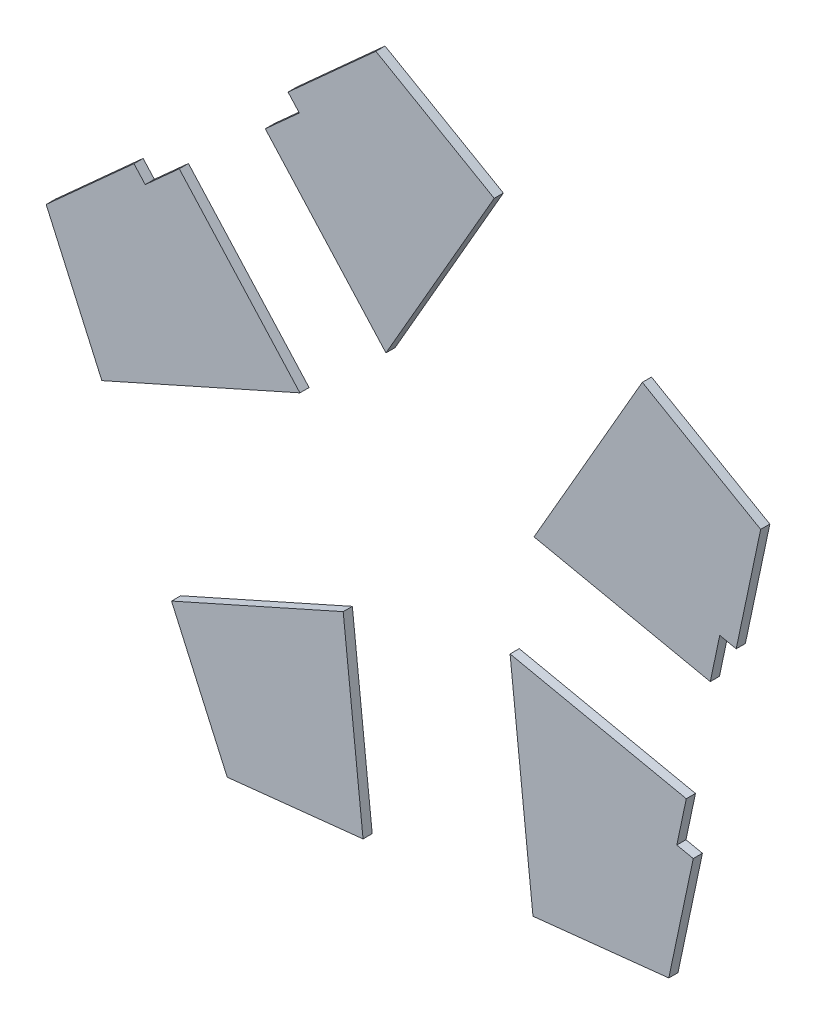
ISO-10303-21;
HEADER;
FILE_DESCRIPTION(('STEP AP214'),'2;1');
FILE_NAME('part.step','',(''),(''),'','','');
FILE_SCHEMA(('AUTOMOTIVE_DESIGN { 1 0 10303 214 1 1 1 1 }'));
ENDSEC;
DATA;
#1=APPLICATION_CONTEXT('core data for automotive mechanical design processes');
#2=APPLICATION_PROTOCOL_DEFINITION('international standard','automotive_design',2000,#1);
#3=PRODUCT_CONTEXT('',#1,'mechanical');
#4=PRODUCT('Part','Part','',(#3));
#5=PRODUCT_RELATED_PRODUCT_CATEGORY('part','',(#4));
#6=PRODUCT_DEFINITION_FORMATION('','',#4);
#7=PRODUCT_DEFINITION_CONTEXT('part definition',#1,'design');
#8=PRODUCT_DEFINITION('design','',#6,#7);
#9=PRODUCT_DEFINITION_SHAPE('','',#8);
#10=(LENGTH_UNIT() NAMED_UNIT(*) SI_UNIT(.MILLI.,.METRE.));
#11=(NAMED_UNIT(*) PLANE_ANGLE_UNIT() SI_UNIT($,.RADIAN.));
#12=(NAMED_UNIT(*) SI_UNIT($,.STERADIAN.) SOLID_ANGLE_UNIT());
#13=UNCERTAINTY_MEASURE_WITH_UNIT(LENGTH_MEASURE(1.E-05),#10,'distance_accuracy_value','');
#14=(GEOMETRIC_REPRESENTATION_CONTEXT(3) GLOBAL_UNCERTAINTY_ASSIGNED_CONTEXT((#13)) GLOBAL_UNIT_ASSIGNED_CONTEXT((#10,
#11,#12)) REPRESENTATION_CONTEXT('',''));
#15=CARTESIAN_POINT('',(0.,0.,0.));
#16=DIRECTION('',(0.,0.,1.));
#17=DIRECTION('',(1.,0.,0.));
#18=AXIS2_PLACEMENT_3D('',#15,#16,#17);
#19=CARTESIAN_POINT('',(38.3641637728832,-96.4882416000768,3.));
#20=DIRECTION('',(-0.99440869424987,-0.10559994697096,0.));
#21=DIRECTION('',(0.10559994697096,-0.99440869424987,0.));
#22=AXIS2_PLACEMENT_3D('',#19,#20,#21);
#23=PLANE('',#22);
#24=DIRECTION('',(-0.10559994697096,0.994408694249869,0.));
#25=VECTOR('',#24,1.);
#26=CARTESIAN_POINT('',(38.3641637728832,-96.4882416000768,0.));
#27=LINE('',#26,#25);
#28=CARTESIAN_POINT('',(38.3641637728832,-96.4882416000768,0.));
#29=VERTEX_POINT('',#28);
#30=CARTESIAN_POINT('',(30.8688034357799,-25.9062792076065,0.));
#31=VERTEX_POINT('',#30);
#32=EDGE_CURVE('E98',#29,#31,#27,.T.);
#33=ORIENTED_EDGE('',*,*,#32,.F.);
#34=DIRECTION('',(0.,0.,-1.));
#35=VECTOR('',#34,1.);
#36=CARTESIAN_POINT('',(38.3641637728832,-96.4882416000768,3.));
#37=LINE('',#36,#35);
#38=CARTESIAN_POINT('',(38.3641637728832,-96.4882416000768,3.));
#39=VERTEX_POINT('',#38);
#40=EDGE_CURVE('E137',#39,#29,#37,.T.);
#41=ORIENTED_EDGE('',*,*,#40,.F.);
#42=DIRECTION('',(-0.10559994697096,0.994408694249869,0.));
#43=VECTOR('',#42,1.);
#44=CARTESIAN_POINT('',(37.7833640645429,-91.0189937817025,3.));
#45=LINE('',#44,#43);
#46=CARTESIAN_POINT('',(30.8688034357799,-25.9062792076065,3.));
#47=VERTEX_POINT('',#46);
#48=EDGE_CURVE('E84',#39,#47,#45,.T.);
#49=ORIENTED_EDGE('',*,*,#48,.T.);
#50=DIRECTION('',(0.,0.,-1.));
#51=VECTOR('',#50,1.);
#52=CARTESIAN_POINT('',(30.8688034357799,-25.9062792076065,3.));
#53=LINE('',#52,#51);
#54=EDGE_CURVE('E128',#47,#31,#53,.T.);
#55=ORIENTED_EDGE('',*,*,#54,.T.);
#56=EDGE_LOOP('',(#33,#41,#49,#55));
#57=FACE_BOUND('',#56,.T.);
#58=ADVANCED_FACE('F80',(#57),#23,.T.);
#59=CARTESIAN_POINT('',(82.808015356177,-91.7685841820356,3.));
#60=DIRECTION('',(0.105599946970959,-0.99440869424987,0.));
#61=DIRECTION('',(0.99440869424987,0.105599946970959,0.));
#62=AXIS2_PLACEMENT_3D('',#59,#60,#61);
#63=PLANE('',#62);
#64=DIRECTION('',(-0.994408694249869,-0.105599946970959,0.));
#65=VECTOR('',#64,1.);
#66=CARTESIAN_POINT('',(82.808015356177,-91.7685841820356,0.));
#67=LINE('',#66,#65);
#68=CARTESIAN_POINT('',(82.808015356177,-91.7685841820356,0.));
#69=VERTEX_POINT('',#68);
#70=EDGE_CURVE('E175',#69,#29,#67,.T.);
#71=ORIENTED_EDGE('',*,*,#70,.F.);
#72=DIRECTION('',(0.,0.,-1.));
#73=VECTOR('',#72,1.);
#74=CARTESIAN_POINT('',(82.808015356177,-91.7685841820356,3.));
#75=LINE('',#74,#73);
#76=CARTESIAN_POINT('',(82.808015356177,-91.7685841820356,3.));
#77=VERTEX_POINT('',#76);
#78=EDGE_CURVE('E183',#77,#69,#75,.T.);
#79=ORIENTED_EDGE('',*,*,#78,.F.);
#80=DIRECTION('',(-0.994408694249869,-0.105599946970959,0.));
#81=VECTOR('',#80,1.);
#82=CARTESIAN_POINT('',(82.808015356177,-91.7685841820356,3.));
#83=LINE('',#82,#81);
#84=EDGE_CURVE('E165',#77,#39,#83,.T.);
#85=ORIENTED_EDGE('',*,*,#84,.T.);
#86=ORIENTED_EDGE('',*,*,#40,.T.);
#87=EDGE_LOOP('',(#71,#79,#85,#86));
#88=FACE_BOUND('',#87,.T.);
#89=ADVANCED_FACE('F185',(#88),#63,.T.);
#90=CARTESIAN_POINT('',(90.8121138406082,-53.9117414505947,3.));
#91=DIRECTION('',(0.978371046746013,-0.206857668190256,0.));
#92=DIRECTION('',(0.206857668190256,0.978371046746013,0.));
#93=AXIS2_PLACEMENT_3D('',#90,#91,#92);
#94=PLANE('',#93);
#95=DIRECTION('',(-0.206857668190256,-0.978371046746013,0.));
#96=VECTOR('',#95,1.);
#97=CARTESIAN_POINT('',(90.8121138406082,-53.9117414505947,0.));
#98=LINE('',#97,#96);
#99=CARTESIAN_POINT('',(90.8121138406082,-53.9117414505947,0.));
#100=VERTEX_POINT('',#99);
#101=EDGE_CURVE('E159',#100,#69,#98,.T.);
#102=ORIENTED_EDGE('',*,*,#101,.F.);
#103=DIRECTION('',(0.,0.,-1.));
#104=VECTOR('',#103,1.);
#105=CARTESIAN_POINT('',(90.8121138406082,-53.9117414505947,3.));
#106=LINE('',#105,#104);
#107=CARTESIAN_POINT('',(90.8121138406082,-53.9117414505947,3.));
#108=VERTEX_POINT('',#107);
#109=EDGE_CURVE('E152',#108,#100,#106,.T.);
#110=ORIENTED_EDGE('',*,*,#109,.F.);
#111=DIRECTION('',(-0.206857668190256,-0.978371046746013,0.));
#112=VECTOR('',#111,1.);
#113=CARTESIAN_POINT('',(90.8121138406082,-53.9117414505947,3.));
#114=LINE('',#113,#112);
#115=EDGE_CURVE('E167',#108,#77,#114,.T.);
#116=ORIENTED_EDGE('',*,*,#115,.T.);
#117=ORIENTED_EDGE('',*,*,#78,.T.);
#118=EDGE_LOOP('',(#102,#110,#116,#117));
#119=FACE_BOUND('',#118,.T.);
#120=ADVANCED_FACE('F181',(#119),#94,.T.);
#121=CARTESIAN_POINT('',(85.4310730835052,-52.7740242755484,3.));
#122=DIRECTION('',(0.206857668190247,0.978371046746015,0.));
#123=DIRECTION('',(-0.978371046746015,0.206857668190247,0.));
#124=AXIS2_PLACEMENT_3D('',#121,#122,#123);
#125=PLANE('',#124);
#126=DIRECTION('',(0.978371046746015,-0.206857668190247,0.));
#127=VECTOR('',#126,1.);
#128=CARTESIAN_POINT('',(85.4310730835052,-52.7740242755484,0.));
#129=LINE('',#128,#127);
#130=CARTESIAN_POINT('',(85.4310730835052,-52.7740242755484,0.));
#131=VERTEX_POINT('',#130);
#132=EDGE_CURVE('E155',#131,#100,#129,.T.);
#133=ORIENTED_EDGE('',*,*,#132,.F.);
#134=DIRECTION('',(0.,0.,-1.));
#135=VECTOR('',#134,1.);
#136=CARTESIAN_POINT('',(85.4310730835052,-52.7740242755484,3.));
#137=LINE('',#136,#135);
#138=CARTESIAN_POINT('',(85.4310730835052,-52.7740242755484,3.));
#139=VERTEX_POINT('',#138);
#140=EDGE_CURVE('E144',#139,#131,#137,.T.);
#141=ORIENTED_EDGE('',*,*,#140,.F.);
#142=DIRECTION('',(0.978371046746015,-0.206857668190247,0.));
#143=VECTOR('',#142,1.);
#144=CARTESIAN_POINT('',(85.4310730835052,-52.7740242755484,3.));
#145=LINE('',#144,#143);
#146=EDGE_CURVE('E170',#139,#108,#145,.T.);
#147=ORIENTED_EDGE('',*,*,#146,.T.);
#148=ORIENTED_EDGE('',*,*,#109,.T.);
#149=EDGE_LOOP('',(#133,#141,#147,#148));
#150=FACE_BOUND('',#149,.T.);
#151=ADVANCED_FACE('F156',(#150),#125,.T.);
#152=CARTESIAN_POINT('',(88.5339381061341,-38.0984585754218,3.));
#153=DIRECTION('',(0.978371046746013,-0.206857668190257,0.));
#154=DIRECTION('',(0.206857668190257,0.978371046746013,0.));
#155=AXIS2_PLACEMENT_3D('',#152,#153,#154);
#156=PLANE('',#155);
#157=DIRECTION('',(-0.206857668190257,-0.978371046746013,0.));
#158=VECTOR('',#157,1.);
#159=CARTESIAN_POINT('',(88.5339381061341,-38.0984585754218,0.));
#160=LINE('',#159,#158);
#161=CARTESIAN_POINT('',(88.5339381061341,-38.0984585754218,0.));
#162=VERTEX_POINT('',#161);
#163=EDGE_CURVE('E90',#162,#131,#160,.T.);
#164=ORIENTED_EDGE('',*,*,#163,.F.);
#165=DIRECTION('',(0.,0.,-1.));
#166=VECTOR('',#165,1.);
#167=CARTESIAN_POINT('',(88.5339381061341,-38.0984585754218,3.));
#168=LINE('',#167,#166);
#169=CARTESIAN_POINT('',(88.5339381061341,-38.0984585754218,3.));
#170=VERTEX_POINT('',#169);
#171=EDGE_CURVE('E121',#170,#162,#168,.T.);
#172=ORIENTED_EDGE('',*,*,#171,.F.);
#173=DIRECTION('',(-0.206857668190257,-0.978371046746013,0.));
#174=VECTOR('',#173,1.);
#175=CARTESIAN_POINT('',(88.5339381061341,-38.0984585754218,3.));
#176=LINE('',#175,#174);
#177=EDGE_CURVE('E148',#170,#139,#176,.T.);
#178=ORIENTED_EDGE('',*,*,#177,.T.);
#179=ORIENTED_EDGE('',*,*,#140,.T.);
#180=EDGE_LOOP('',(#164,#172,#178,#179));
#181=FACE_BOUND('',#180,.T.);
#182=ADVANCED_FACE('F146',(#181),#156,.T.);
#183=CARTESIAN_POINT('',(30.8688034357799,-25.9062792076065,3.));
#184=DIRECTION('',(0.206857668130798,0.978371046758585,0.));
#185=DIRECTION('',(-0.978371046758585,0.206857668130798,0.));
#186=AXIS2_PLACEMENT_3D('',#183,#184,#185);
#187=PLANE('',#186);
#188=DIRECTION('',(0.978371046758585,-0.206857668130798,0.));
#189=VECTOR('',#188,1.);
#190=CARTESIAN_POINT('',(30.8688034357799,-25.9062792076065,0.));
#191=LINE('',#190,#189);
#192=EDGE_CURVE('E13',#31,#162,#191,.T.);
#193=ORIENTED_EDGE('',*,*,#192,.F.);
#194=ORIENTED_EDGE('',*,*,#54,.F.);
#195=DIRECTION('',(0.978371046758585,-0.206857668130798,0.));
#196=VECTOR('',#195,1.);
#197=CARTESIAN_POINT('',(30.8688034357799,-25.9062792076065,3.));
#198=LINE('',#197,#196);
#199=EDGE_CURVE('E172',#47,#170,#198,.T.);
#200=ORIENTED_EDGE('',*,*,#199,.T.);
#201=ORIENTED_EDGE('',*,*,#171,.T.);
#202=EDGE_LOOP('',(#193,#194,#200,#201));
#203=FACE_BOUND('',#202,.T.);
#204=ADVANCED_FACE('F199',(#203),#187,.T.);
#205=CARTESIAN_POINT('',(0.,0.,3.));
#206=DIRECTION('',(0.,0.,1.));
#207=DIRECTION('',(1.,0.,0.));
#208=AXIS2_PLACEMENT_3D('',#205,#206,#207);
#209=PLANE('',#208);
#210=ORIENTED_EDGE('',*,*,#48,.F.);
#211=ORIENTED_EDGE('',*,*,#84,.F.);
#212=ORIENTED_EDGE('',*,*,#115,.F.);
#213=ORIENTED_EDGE('',*,*,#146,.F.);
#214=ORIENTED_EDGE('',*,*,#177,.F.);
#215=ORIENTED_EDGE('',*,*,#199,.F.);
#216=EDGE_LOOP('',(#210,#211,#212,#213,#214,#215));
#217=FACE_BOUND('',#216,.T.);
#218=ADVANCED_FACE('F82',(#217),#209,.T.);
#219=CARTESIAN_POINT('',(0.,0.,0.));
#220=DIRECTION('',(0.,0.,1.));
#221=DIRECTION('',(1.,0.,0.));
#222=AXIS2_PLACEMENT_3D('',#219,#220,#221);
#223=PLANE('',#222);
#224=ORIENTED_EDGE('',*,*,#32,.T.);
#225=ORIENTED_EDGE('',*,*,#192,.T.);
#226=ORIENTED_EDGE('',*,*,#163,.T.);
#227=ORIENTED_EDGE('',*,*,#132,.T.);
#228=ORIENTED_EDGE('',*,*,#101,.T.);
#229=ORIENTED_EDGE('',*,*,#70,.T.);
#230=EDGE_LOOP('',(#224,#225,#226,#227,#228,#229));
#231=FACE_BOUND('',#230,.T.);
#232=ADVANCED_FACE('F161',(#231),#223,.F.);
#233=CLOSED_SHELL('',(#58,#89,#120,#151,#182,#204,#218,#232));
#234=MANIFOLD_SOLID_BREP('B2',#233);
#235=CARTESIAN_POINT('',(97.8371046746014,-20.6857668190256,3.));
#236=DIRECTION('',(-0.978371046746013,0.206857668190256,0.));
#237=DIRECTION('',(-0.206857668190256,-0.978371046746014,0.));
#238=AXIS2_PLACEMENT_3D('',#235,#236,#237);
#239=PLANE('',#238);
#240=DIRECTION('',(0.206857668190256,0.978371046746013,0.));
#241=VECTOR('',#240,1.);
#242=CARTESIAN_POINT('',(97.8371046746014,-20.6857668190256,0.));
#243=LINE('',#242,#241);
#244=CARTESIAN_POINT('',(104.862095509335,12.5402078160479,0.));
#245=VERTEX_POINT('',#244);
#246=CARTESIAN_POINT('',(112.866193993026,50.3970505439844,0.));
#247=VERTEX_POINT('',#246);
#248=EDGE_CURVE('E78',#245,#247,#243,.T.);
#249=ORIENTED_EDGE('',*,*,#248,.T.);
#250=DIRECTION('',(0.,0.,-1.));
#251=VECTOR('',#250,1.);
#252=CARTESIAN_POINT('',(112.866193993026,50.3970505439844,3.));
#253=LINE('',#252,#251);
#254=CARTESIAN_POINT('',(112.866193993026,50.3970505439844,3.));
#255=VERTEX_POINT('',#254);
#256=EDGE_CURVE('E371',#255,#247,#253,.T.);
#257=ORIENTED_EDGE('',*,*,#256,.F.);
#258=DIRECTION('',(0.206857668190256,0.978371046746013,0.));
#259=VECTOR('',#258,1.);
#260=CARTESIAN_POINT('',(97.8371046746014,-20.6857668190256,3.));
#261=LINE('',#260,#259);
#262=CARTESIAN_POINT('',(104.862095509335,12.5402078160479,3.));
#263=VERTEX_POINT('',#262);
#264=EDGE_CURVE('E273',#263,#255,#261,.T.);
#265=ORIENTED_EDGE('',*,*,#264,.F.);
#266=DIRECTION('',(0.,0.,-1.));
#267=VECTOR('',#266,1.);
#268=CARTESIAN_POINT('',(104.862095509335,12.5402078160479,3.));
#269=LINE('',#268,#267);
#270=EDGE_CURVE('E359',#263,#245,#269,.T.);
#271=ORIENTED_EDGE('',*,*,#270,.T.);
#272=EDGE_LOOP('',(#249,#257,#265,#271));
#273=FACE_BOUND('',#272,.T.);
#274=ADVANCED_FACE('F269',(#273),#239,.F.);
#275=CARTESIAN_POINT('',(49.9066613526888,86.6563624474743,3.));
#276=DIRECTION('',(-0.499066613526888,-0.866563624474743,0.));
#277=DIRECTION('',(0.866563624474744,-0.499066613526888,0.));
#278=AXIS2_PLACEMENT_3D('',#275,#276,#277);
#279=PLANE('',#278);
#280=DIRECTION('',(-0.866563624474743,0.499066613526888,0.));
#281=VECTOR('',#280,1.);
#282=CARTESIAN_POINT('',(49.9066613526888,86.6563624474743,0.));
#283=LINE('',#282,#281);
#284=CARTESIAN_POINT('',(74.1362177404657,72.7022080008968,0.));
#285=VERTEX_POINT('',#284);
#286=EDGE_CURVE('E279',#247,#285,#283,.T.);
#287=ORIENTED_EDGE('',*,*,#286,.T.);
#288=DIRECTION('',(0.,0.,-1.));
#289=VECTOR('',#288,1.);
#290=CARTESIAN_POINT('',(74.1362177404657,72.7022080008968,3.));
#291=LINE('',#290,#289);
#292=CARTESIAN_POINT('',(74.1362177404657,72.7022080008968,3.));
#293=VERTEX_POINT('',#292);
#294=EDGE_CURVE('E337',#293,#285,#291,.T.);
#295=ORIENTED_EDGE('',*,*,#294,.F.);
#296=DIRECTION('',(-0.866563624474743,0.499066613526888,0.));
#297=VECTOR('',#296,1.);
#298=CARTESIAN_POINT('',(49.9066613526888,86.6563624474743,3.));
#299=LINE('',#298,#297);
#300=EDGE_CURVE('E309',#255,#293,#299,.T.);
#301=ORIENTED_EDGE('',*,*,#300,.F.);
#302=ORIENTED_EDGE('',*,*,#256,.T.);
#303=EDGE_LOOP('',(#287,#295,#301,#302));
#304=FACE_BOUND('',#303,.T.);
#305=ADVANCED_FACE('F372',(#304),#279,.F.);
#306=CARTESIAN_POINT('',(24.2295563877769,-13.9541544465775,3.));
#307=DIRECTION('',(0.866563624474743,-0.499066613526888,0.));
#308=DIRECTION('',(0.499066613526888,0.866563624474744,0.));
#309=AXIS2_PLACEMENT_3D('',#306,#307,#308);
#310=PLANE('',#309);
#311=DIRECTION('',(-0.499066613526888,-0.866563624474743,0.));
#312=VECTOR('',#311,1.);
#313=CARTESIAN_POINT('',(24.2295563877769,-13.9541544465775,0.));
#314=LINE('',#313,#312);
#315=CARTESIAN_POINT('',(38.7130550599902,11.1945386622876,0.));
#316=VERTEX_POINT('',#315);
#317=EDGE_CURVE('E331',#285,#316,#314,.T.);
#318=ORIENTED_EDGE('',*,*,#317,.T.);
#319=DIRECTION('',(0.,0.,-1.));
#320=VECTOR('',#319,1.);
#321=CARTESIAN_POINT('',(38.7130550599902,11.1945386622876,3.));
#322=LINE('',#321,#320);
#323=CARTESIAN_POINT('',(38.7130550599902,11.1945386622876,3.));
#324=VERTEX_POINT('',#323);
#325=EDGE_CURVE('E335',#324,#316,#322,.T.);
#326=ORIENTED_EDGE('',*,*,#325,.F.);
#327=DIRECTION('',(-0.499066613526888,-0.866563624474743,0.));
#328=VECTOR('',#327,1.);
#329=CARTESIAN_POINT('',(24.2295563877769,-13.9541544465775,3.));
#330=LINE('',#329,#328);
#331=EDGE_CURVE('E362',#293,#324,#330,.T.);
#332=ORIENTED_EDGE('',*,*,#331,.F.);
#333=ORIENTED_EDGE('',*,*,#294,.T.);
#334=EDGE_LOOP('',(#318,#326,#332,#333));
#335=FACE_BOUND('',#334,.T.);
#336=ADVANCED_FACE('F333',(#335),#310,.F.);
#337=CARTESIAN_POINT('',(3.92212581210513,18.5504089349471,3.));
#338=DIRECTION('',(0.206857668190257,0.978371046746013,0.));
#339=DIRECTION('',(-0.978371046746013,0.206857668190257,0.));
#340=AXIS2_PLACEMENT_3D('',#337,#338,#339);
#341=PLANE('',#340);
#342=DIRECTION('',(0.978371046746013,-0.206857668190257,0.));
#343=VECTOR('',#342,1.);
#344=CARTESIAN_POINT('',(3.92212581210513,18.5504089349471,0.));
#345=LINE('',#344,#343);
#346=CARTESIAN_POINT('',(96.3781897296034,-0.997640709032199,0.));
#347=VERTEX_POINT('',#346);
#348=EDGE_CURVE('E339',#316,#347,#345,.T.);
#349=ORIENTED_EDGE('',*,*,#348,.T.);
#350=DIRECTION('',(0.,0.,-1.));
#351=VECTOR('',#350,1.);
#352=CARTESIAN_POINT('',(96.3781897296034,-0.997640709032199,3.));
#353=LINE('',#352,#351);
#354=CARTESIAN_POINT('',(96.3781897296034,-0.997640709032199,3.));
#355=VERTEX_POINT('',#354);
#356=EDGE_CURVE('E346',#355,#347,#353,.T.);
#357=ORIENTED_EDGE('',*,*,#356,.F.);
#358=DIRECTION('',(0.978371046746013,-0.206857668190257,0.));
#359=VECTOR('',#358,1.);
#360=CARTESIAN_POINT('',(3.92212581210513,18.5504089349471,3.));
#361=LINE('',#360,#359);
#362=EDGE_CURVE('E345',#324,#355,#361,.T.);
#363=ORIENTED_EDGE('',*,*,#362,.F.);
#364=ORIENTED_EDGE('',*,*,#325,.T.);
#365=EDGE_LOOP('',(#349,#357,#363,#364));
#366=FACE_BOUND('',#365,.T.);
#367=ADVANCED_FACE('F342',(#366),#341,.F.);
#368=CARTESIAN_POINT('',(92.4560639174983,-19.5480496439793,3.));
#369=DIRECTION('',(-0.978371046746013,0.206857668190257,0.));
#370=DIRECTION('',(-0.206857668190257,-0.978371046746013,0.));
#371=AXIS2_PLACEMENT_3D('',#368,#369,#370);
#372=PLANE('',#371);
#373=DIRECTION('',(0.206857668190257,0.978371046746013,0.));
#374=VECTOR('',#373,1.);
#375=CARTESIAN_POINT('',(92.4560639174983,-19.5480496439793,0.));
#376=LINE('',#375,#374);
#377=CARTESIAN_POINT('',(99.4810547522324,13.6779249910943,0.));
#378=VERTEX_POINT('',#377);
#379=EDGE_CURVE('E350',#347,#378,#376,.T.);
#380=ORIENTED_EDGE('',*,*,#379,.T.);
#381=DIRECTION('',(0.,0.,-1.));
#382=VECTOR('',#381,1.);
#383=CARTESIAN_POINT('',(99.4810547522324,13.6779249910943,3.));
#384=LINE('',#383,#382);
#385=CARTESIAN_POINT('',(99.4810547522324,13.6779249910943,3.));
#386=VERTEX_POINT('',#385);
#387=EDGE_CURVE('E367',#386,#378,#384,.T.);
#388=ORIENTED_EDGE('',*,*,#387,.F.);
#389=DIRECTION('',(0.206857668190257,0.978371046746013,0.));
#390=VECTOR('',#389,1.);
#391=CARTESIAN_POINT('',(92.4560639174983,-19.5480496439793,3.));
#392=LINE('',#391,#390);
#393=EDGE_CURVE('E358',#355,#386,#392,.T.);
#394=ORIENTED_EDGE('',*,*,#393,.F.);
#395=ORIENTED_EDGE('',*,*,#356,.T.);
#396=EDGE_LOOP('',(#380,#388,#394,#395));
#397=FACE_BOUND('',#396,.T.);
#398=ADVANCED_FACE('F379',(#397),#372,.F.);
#399=CARTESIAN_POINT('',(7.02499083473406,33.2259746350735,3.));
#400=DIRECTION('',(0.206857668190256,0.978371046746013,0.));
#401=DIRECTION('',(-0.978371046746013,0.206857668190256,0.));
#402=AXIS2_PLACEMENT_3D('',#399,#400,#401);
#403=PLANE('',#402);
#404=DIRECTION('',(0.978371046746013,-0.206857668190256,0.));
#405=VECTOR('',#404,1.);
#406=CARTESIAN_POINT('',(7.02499083473406,33.2259746350735,0.));
#407=LINE('',#406,#405);
#408=EDGE_CURVE('E320',#378,#245,#407,.T.);
#409=ORIENTED_EDGE('',*,*,#408,.T.);
#410=ORIENTED_EDGE('',*,*,#270,.F.);
#411=DIRECTION('',(0.978371046746013,-0.206857668190256,0.));
#412=VECTOR('',#411,1.);
#413=CARTESIAN_POINT('',(7.02499083473406,33.2259746350735,3.));
#414=LINE('',#413,#412);
#415=EDGE_CURVE('E356',#386,#263,#414,.T.);
#416=ORIENTED_EDGE('',*,*,#415,.F.);
#417=ORIENTED_EDGE('',*,*,#387,.T.);
#418=EDGE_LOOP('',(#409,#410,#416,#417));
#419=FACE_BOUND('',#418,.T.);
#420=ADVANCED_FACE('F375',(#419),#403,.F.);
#421=CARTESIAN_POINT('',(0.,0.,3.));
#422=DIRECTION('',(0.,0.,1.));
#423=DIRECTION('',(1.,0.,0.));
#424=AXIS2_PLACEMENT_3D('',#421,#422,#423);
#425=PLANE('',#424);
#426=ORIENTED_EDGE('',*,*,#264,.T.);
#427=ORIENTED_EDGE('',*,*,#300,.T.);
#428=ORIENTED_EDGE('',*,*,#331,.T.);
#429=ORIENTED_EDGE('',*,*,#362,.T.);
#430=ORIENTED_EDGE('',*,*,#393,.T.);
#431=ORIENTED_EDGE('',*,*,#415,.T.);
#432=EDGE_LOOP('',(#426,#427,#428,#429,#430,#431));
#433=FACE_BOUND('',#432,.T.);
#434=ADVANCED_FACE('F271',(#433),#425,.T.);
#435=CARTESIAN_POINT('',(0.,0.,0.));
#436=DIRECTION('',(0.,0.,1.));
#437=DIRECTION('',(1.,0.,0.));
#438=AXIS2_PLACEMENT_3D('',#435,#436,#437);
#439=PLANE('',#438);
#440=ORIENTED_EDGE('',*,*,#248,.F.);
#441=ORIENTED_EDGE('',*,*,#408,.F.);
#442=ORIENTED_EDGE('',*,*,#379,.F.);
#443=ORIENTED_EDGE('',*,*,#348,.F.);
#444=ORIENTED_EDGE('',*,*,#317,.F.);
#445=ORIENTED_EDGE('',*,*,#286,.F.);
#446=EDGE_LOOP('',(#440,#441,#442,#443,#444,#445));
#447=FACE_BOUND('',#446,.T.);
#448=ADVANCED_FACE('F349',(#447),#439,.F.);
#449=CLOSED_SHELL('',(#274,#305,#336,#367,#398,#420,#434,#448));
#450=MANIFOLD_SOLID_BREP('B7',#449);
#451=CARTESIAN_POINT('',(49.9066613526889,86.6563624474743,3.));
#452=DIRECTION('',(0.499066613526889,0.866563624474742,0.));
#453=DIRECTION('',(-0.866563624474743,0.499066613526889,0.));
#454=AXIS2_PLACEMENT_3D('',#451,#452,#453);
#455=PLANE('',#454);
#456=DIRECTION('',(0.866563624474743,-0.499066613526889,0.));
#457=VECTOR('',#456,1.);
#458=CARTESIAN_POINT('',(49.9066613526889,86.6563624474743,0.));
#459=LINE('',#458,#457);
#460=CARTESIAN_POINT('',(-13.0528712876479,122.915674350964,0.));
#461=VERTEX_POINT('',#460);
#462=CARTESIAN_POINT('',(25.6771049649121,100.610516894052,0.));
#463=VERTEX_POINT('',#462);
#464=EDGE_CURVE('E267',#461,#463,#459,.T.);
#465=ORIENTED_EDGE('',*,*,#464,.F.);
#466=DIRECTION('',(0.,0.,-1.));
#467=VECTOR('',#466,1.);
#468=CARTESIAN_POINT('',(-13.0528712876479,122.915674350964,3.));
#469=LINE('',#468,#467);
#470=CARTESIAN_POINT('',(-13.0528712876479,122.915674350964,3.));
#471=VERTEX_POINT('',#470);
#472=EDGE_CURVE('E474',#471,#461,#469,.T.);
#473=ORIENTED_EDGE('',*,*,#472,.F.);
#474=DIRECTION('',(0.866563624474743,-0.499066613526889,0.));
#475=VECTOR('',#474,1.);
#476=CARTESIAN_POINT('',(49.9066613526889,86.6563624474743,3.));
#477=LINE('',#476,#475);
#478=CARTESIAN_POINT('',(25.6771049649121,100.610516894052,3.));
#479=VERTEX_POINT('',#478);
#480=EDGE_CURVE('E459',#471,#479,#477,.T.);
#481=ORIENTED_EDGE('',*,*,#480,.T.);
#482=DIRECTION('',(0.,0.,-1.));
#483=VECTOR('',#482,1.);
#484=CARTESIAN_POINT('',(25.6771049649121,100.610516894052,3.));
#485=LINE('',#484,#483);
#486=EDGE_CURVE('E503',#479,#463,#485,.T.);
#487=ORIENTED_EDGE('',*,*,#486,.T.);
#488=EDGE_LOOP('',(#465,#473,#481,#487));
#489=FACE_BOUND('',#488,.T.);
#490=ADVANCED_FACE('F455',(#489),#455,.T.);
#491=CARTESIAN_POINT('',(-66.9930916936088,74.2423441529947,3.));
#492=DIRECTION('',(-0.669930916936089,0.742423441529948,0.));
#493=DIRECTION('',(-0.742423441529948,-0.669930916936089,0.));
#494=AXIS2_PLACEMENT_3D('',#491,#492,#493);
#495=PLANE('',#494);
#496=DIRECTION('',(0.742423441529948,0.669930916936088,0.));
#497=VECTOR('',#496,1.);
#498=CARTESIAN_POINT('',(-66.9930916936088,74.2423441529947,0.));
#499=LINE('',#498,#497);
#500=CARTESIAN_POINT('',(-41.7800168421,96.9935362748941,0.));
#501=VERTEX_POINT('',#500);
#502=EDGE_CURVE('E465',#501,#461,#499,.T.);
#503=ORIENTED_EDGE('',*,*,#502,.F.);
#504=DIRECTION('',(0.,0.,-1.));
#505=VECTOR('',#504,1.);
#506=CARTESIAN_POINT('',(-41.7800168421,96.9935362748941,3.));
#507=LINE('',#506,#505);
#508=CARTESIAN_POINT('',(-41.7800168421,96.9935362748941,3.));
#509=VERTEX_POINT('',#508);
#510=EDGE_CURVE('E494',#509,#501,#507,.T.);
#511=ORIENTED_EDGE('',*,*,#510,.F.);
#512=DIRECTION('',(0.742423441529948,0.669930916936088,0.));
#513=VECTOR('',#512,1.);
#514=CARTESIAN_POINT('',(-66.9930916936088,74.2423441529947,3.));
#515=LINE('',#514,#513);
#516=EDGE_CURVE('E550',#509,#471,#515,.T.);
#517=ORIENTED_EDGE('',*,*,#516,.T.);
#518=ORIENTED_EDGE('',*,*,#472,.T.);
#519=EDGE_LOOP('',(#503,#511,#517,#518));
#520=FACE_BOUND('',#519,.T.);
#521=ADVANCED_FACE('F573',(#520),#495,.T.);
#522=CARTESIAN_POINT('',(25.2130748515089,22.7511921218995,3.));
#523=DIRECTION('',(-0.742423441529947,-0.66993091693609,0.));
#524=DIRECTION('',(0.66993091693609,-0.742423441529947,0.));
#525=AXIS2_PLACEMENT_3D('',#522,#523,#524);
#526=PLANE('',#525);
#527=DIRECTION('',(-0.66993091693609,0.742423441529947,0.));
#528=VECTOR('',#527,1.);
#529=CARTESIAN_POINT('',(25.2130748515089,22.7511921218995,0.));
#530=LINE('',#529,#528);
#531=CARTESIAN_POINT('',(-38.0953967989516,92.9102073464794,0.));
#532=VERTEX_POINT('',#531);
#533=EDGE_CURVE('E527',#532,#501,#530,.T.);
#534=ORIENTED_EDGE('',*,*,#533,.F.);
#535=DIRECTION('',(0.,0.,-1.));
#536=VECTOR('',#535,1.);
#537=CARTESIAN_POINT('',(-38.0953967989516,92.9102073464794,3.));
#538=LINE('',#537,#536);
#539=CARTESIAN_POINT('',(-38.0953967989516,92.9102073464794,3.));
#540=VERTEX_POINT('',#539);
#541=EDGE_CURVE('E513',#540,#532,#538,.T.);
#542=ORIENTED_EDGE('',*,*,#541,.F.);
#543=DIRECTION('',(-0.66993091693609,0.742423441529947,0.));
#544=VECTOR('',#543,1.);
#545=CARTESIAN_POINT('',(25.2130748515089,22.7511921218995,3.));
#546=LINE('',#545,#544);
#547=EDGE_CURVE('E549',#540,#509,#546,.T.);
#548=ORIENTED_EDGE('',*,*,#547,.T.);
#549=ORIENTED_EDGE('',*,*,#510,.T.);
#550=EDGE_LOOP('',(#534,#542,#548,#549));
#551=FACE_BOUND('',#550,.T.);
#552=ADVANCED_FACE('F528',(#551),#526,.T.);
#553=CARTESIAN_POINT('',(-63.3084716504605,70.15901522458,3.));
#554=DIRECTION('',(-0.66993091693609,0.742423441529947,0.));
#555=DIRECTION('',(-0.742423441529947,-0.66993091693609,0.));
#556=AXIS2_PLACEMENT_3D('',#553,#554,#555);
#557=PLANE('',#556);
#558=DIRECTION('',(0.742423441529947,0.66993091693609,0.));
#559=VECTOR('',#558,1.);
#560=CARTESIAN_POINT('',(-63.3084716504605,70.15901522458,0.));
#561=LINE('',#560,#559);
#562=CARTESIAN_POINT('',(-49.2317484210937,82.8612435931664,0.));
#563=VERTEX_POINT('',#562);
#564=EDGE_CURVE('E517',#563,#532,#561,.T.);
#565=ORIENTED_EDGE('',*,*,#564,.F.);
#566=DIRECTION('',(0.,0.,-1.));
#567=VECTOR('',#566,1.);
#568=CARTESIAN_POINT('',(-49.2317484210937,82.8612435931664,3.));
#569=LINE('',#568,#567);
#570=CARTESIAN_POINT('',(-49.2317484210937,82.8612435931664,3.));
#571=VERTEX_POINT('',#570);
#572=EDGE_CURVE('E524',#571,#563,#569,.T.);
#573=ORIENTED_EDGE('',*,*,#572,.F.);
#574=DIRECTION('',(0.742423441529947,0.66993091693609,0.));
#575=VECTOR('',#574,1.);
#576=CARTESIAN_POINT('',(-63.3084716504605,70.15901522458,3.));
#577=LINE('',#576,#575);
#578=EDGE_CURVE('E520',#571,#540,#577,.T.);
#579=ORIENTED_EDGE('',*,*,#578,.T.);
#580=ORIENTED_EDGE('',*,*,#541,.T.);
#581=EDGE_LOOP('',(#565,#573,#579,#580));
#582=FACE_BOUND('',#581,.T.);
#583=ADVANCED_FACE('F515',(#582),#557,.T.);
#584=CARTESIAN_POINT('',(14.0767232328586,12.7022283732893,3.));
#585=DIRECTION('',(-0.742423441489233,-0.669930916981209,0.));
#586=DIRECTION('',(0.669930916981209,-0.742423441489233,0.));
#587=AXIS2_PLACEMENT_3D('',#584,#585,#586);
#588=PLANE('',#587);
#589=DIRECTION('',(-0.669930916981209,0.742423441489233,0.));
#590=VECTOR('',#589,1.);
#591=CARTESIAN_POINT('',(14.0767232328586,12.7022283732893,0.));
#592=LINE('',#591,#590);
#593=CARTESIAN_POINT('',(-9.74605771556341,39.1028475554426,0.));
#594=VERTEX_POINT('',#593);
#595=EDGE_CURVE('E535',#594,#563,#592,.T.);
#596=ORIENTED_EDGE('',*,*,#595,.F.);
#597=DIRECTION('',(0.,0.,-1.));
#598=VECTOR('',#597,1.);
#599=CARTESIAN_POINT('',(-9.74605771556341,39.1028475554426,3.));
#600=LINE('',#599,#598);
#601=CARTESIAN_POINT('',(-9.74605771556341,39.1028475554426,3.));
#602=VERTEX_POINT('',#601);
#603=EDGE_CURVE('E555',#602,#594,#600,.T.);
#604=ORIENTED_EDGE('',*,*,#603,.F.);
#605=DIRECTION('',(-0.669930916981209,0.742423441489233,0.));
#606=VECTOR('',#605,1.);
#607=CARTESIAN_POINT('',(14.0767232328586,12.7022283732893,3.));
#608=LINE('',#607,#606);
#609=EDGE_CURVE('E545',#602,#571,#608,.T.);
#610=ORIENTED_EDGE('',*,*,#609,.T.);
#611=ORIENTED_EDGE('',*,*,#572,.T.);
#612=EDGE_LOOP('',(#596,#604,#610,#611));
#613=FACE_BOUND('',#612,.T.);
#614=ADVANCED_FACE('F560',(#613),#588,.T.);
#615=CARTESIAN_POINT('',(-24.2295563877767,13.9541544465774,3.));
#616=DIRECTION('',(0.866563624474743,-0.499066613526888,0.));
#617=DIRECTION('',(0.499066613526888,0.866563624474744,0.));
#618=AXIS2_PLACEMENT_3D('',#615,#616,#617);
#619=PLANE('',#618);
#620=DIRECTION('',(-0.499066613526888,-0.866563624474743,0.));
#621=VECTOR('',#620,1.);
#622=CARTESIAN_POINT('',(-24.2295563877767,13.9541544465774,0.));
#623=LINE('',#622,#621);
#624=EDGE_CURVE('E537',#463,#594,#623,.T.);
#625=ORIENTED_EDGE('',*,*,#624,.F.);
#626=ORIENTED_EDGE('',*,*,#486,.F.);
#627=DIRECTION('',(-0.499066613526888,-0.866563624474743,0.));
#628=VECTOR('',#627,1.);
#629=CARTESIAN_POINT('',(-24.2295563877767,13.9541544465774,3.));
#630=LINE('',#629,#628);
#631=EDGE_CURVE('E542',#479,#602,#630,.T.);
#632=ORIENTED_EDGE('',*,*,#631,.T.);
#633=ORIENTED_EDGE('',*,*,#603,.T.);
#634=EDGE_LOOP('',(#625,#626,#632,#633));
#635=FACE_BOUND('',#634,.T.);
#636=ADVANCED_FACE('F564',(#635),#619,.T.);
#637=CARTESIAN_POINT('',(0.,0.,3.));
#638=DIRECTION('',(0.,0.,1.));
#639=DIRECTION('',(1.,0.,0.));
#640=AXIS2_PLACEMENT_3D('',#637,#638,#639);
#641=PLANE('',#640);
#642=ORIENTED_EDGE('',*,*,#480,.F.);
#643=ORIENTED_EDGE('',*,*,#516,.F.);
#644=ORIENTED_EDGE('',*,*,#547,.F.);
#645=ORIENTED_EDGE('',*,*,#578,.F.);
#646=ORIENTED_EDGE('',*,*,#609,.F.);
#647=ORIENTED_EDGE('',*,*,#631,.F.);
#648=EDGE_LOOP('',(#642,#643,#644,#645,#646,#647));
#649=FACE_BOUND('',#648,.T.);
#650=ADVANCED_FACE('F457',(#649),#641,.T.);
#651=CARTESIAN_POINT('',(0.,0.,0.));
#652=DIRECTION('',(0.,0.,1.));
#653=DIRECTION('',(1.,0.,0.));
#654=AXIS2_PLACEMENT_3D('',#651,#652,#653);
#655=PLANE('',#654);
#656=ORIENTED_EDGE('',*,*,#464,.T.);
#657=ORIENTED_EDGE('',*,*,#624,.T.);
#658=ORIENTED_EDGE('',*,*,#595,.T.);
#659=ORIENTED_EDGE('',*,*,#564,.T.);
#660=ORIENTED_EDGE('',*,*,#533,.T.);
#661=ORIENTED_EDGE('',*,*,#502,.T.);
#662=EDGE_LOOP('',(#656,#657,#658,#659,#660,#661));
#663=FACE_BOUND('',#662,.T.);
#664=ADVANCED_FACE('F532',(#663),#655,.F.);
#665=CLOSED_SHELL('',(#490,#521,#552,#583,#614,#636,#650,#664));
#666=MANIFOLD_SOLID_BREP('B72',#665);
#667=CARTESIAN_POINT('',(-66.9930916936089,74.2423441529948,3.));
#668=DIRECTION('',(0.669930916936089,-0.742423441529947,0.));
#669=DIRECTION('',(0.742423441529948,0.669930916936089,0.));
#670=AXIS2_PLACEMENT_3D('',#667,#668,#669);
#671=PLANE('',#670);
#672=DIRECTION('',(-0.742423441529948,-0.669930916936089,0.));
#673=VECTOR('',#672,1.);
#674=CARTESIAN_POINT('',(-66.9930916936089,74.2423441529948,0.));
#675=LINE('',#674,#673);
#676=CARTESIAN_POINT('',(-92.2061665477771,51.4911520286958,0.));
#677=VERTEX_POINT('',#676);
#678=CARTESIAN_POINT('',(-120.93331209957,25.5690139550253,0.));
#679=VERTEX_POINT('',#678);
#680=EDGE_CURVE('E453',#677,#679,#675,.T.);
#681=ORIENTED_EDGE('',*,*,#680,.T.);
#682=DIRECTION('',(0.,0.,-1.));
#683=VECTOR('',#682,1.);
#684=CARTESIAN_POINT('',(-120.93331209957,25.5690139550253,3.));
#685=LINE('',#684,#683);
#686=CARTESIAN_POINT('',(-120.93331209957,25.5690139550253,3.));
#687=VERTEX_POINT('',#686);
#688=EDGE_CURVE('E742',#687,#679,#685,.T.);
#689=ORIENTED_EDGE('',*,*,#688,.F.);
#690=DIRECTION('',(-0.742423441529948,-0.669930916936089,0.));
#691=VECTOR('',#690,1.);
#692=CARTESIAN_POINT('',(-66.9930916936089,74.2423441529948,3.));
#693=LINE('',#692,#691);
#694=CARTESIAN_POINT('',(-92.2061665477771,51.4911520286958,3.));
#695=VERTEX_POINT('',#694);
#696=EDGE_CURVE('E644',#695,#687,#693,.T.);
#697=ORIENTED_EDGE('',*,*,#696,.F.);
#698=DIRECTION('',(0.,0.,-1.));
#699=VECTOR('',#698,1.);
#700=CARTESIAN_POINT('',(-92.2061665477771,51.4911520286958,3.));
#701=LINE('',#700,#699);
#702=EDGE_CURVE('E730',#695,#677,#701,.T.);
#703=ORIENTED_EDGE('',*,*,#702,.T.);
#704=EDGE_LOOP('',(#681,#689,#697,#703));
#705=FACE_BOUND('',#704,.T.);
#706=ADVANCED_FACE('F640',(#705),#671,.F.);
#707=CARTESIAN_POINT('',(-91.3106690307773,-40.7720703564565,3.));
#708=DIRECTION('',(0.913106690307773,0.407720703564565,0.));
#709=DIRECTION('',(-0.407720703564565,0.913106690307773,0.));
#710=AXIS2_PLACEMENT_3D('',#707,#708,#709);
#711=PLANE('',#710);
#712=DIRECTION('',(0.407720703564565,-0.913106690307773,0.));
#713=VECTOR('',#712,1.);
#714=CARTESIAN_POINT('',(-91.3106690307773,-40.7720703564565,0.));
#715=LINE('',#714,#713);
#716=CARTESIAN_POINT('',(-102.710745722745,-15.2411463527185,0.));
#717=VERTEX_POINT('',#716);
#718=EDGE_CURVE('E650',#679,#717,#715,.T.);
#719=ORIENTED_EDGE('',*,*,#718,.T.);
#720=DIRECTION('',(0.,0.,-1.));
#721=VECTOR('',#720,1.);
#722=CARTESIAN_POINT('',(-102.710745722745,-15.2411463527185,3.));
#723=LINE('',#722,#721);
#724=CARTESIAN_POINT('',(-102.710745722745,-15.2411463527185,3.));
#725=VERTEX_POINT('',#724);
#726=EDGE_CURVE('E708',#725,#717,#723,.T.);
#727=ORIENTED_EDGE('',*,*,#726,.F.);
#728=DIRECTION('',(0.407720703564565,-0.913106690307773,0.));
#729=VECTOR('',#728,1.);
#730=CARTESIAN_POINT('',(-91.3106690307773,-40.7720703564565,3.));
#731=LINE('',#730,#729);
#732=EDGE_CURVE('E680',#687,#725,#731,.T.);
#733=ORIENTED_EDGE('',*,*,#732,.F.);
#734=ORIENTED_EDGE('',*,*,#688,.T.);
#735=EDGE_LOOP('',(#719,#727,#733,#734));
#736=FACE_BOUND('',#735,.T.);
#737=ADVANCED_FACE('F743',(#736),#711,.F.);
#738=CARTESIAN_POINT('',(-11.4000766919678,25.530924003738,3.));
#739=DIRECTION('',(-0.407720703564565,0.913106690307773,0.));
#740=DIRECTION('',(-0.913106690307773,-0.407720703564565,0.));
#741=AXIS2_PLACEMENT_3D('',#738,#739,#740);
#742=PLANE('',#741);
#743=DIRECTION('',(0.913106690307773,0.407720703564565,0.));
#744=VECTOR('',#743,1.);
#745=CARTESIAN_POINT('',(-11.4000766919678,25.530924003738,0.));
#746=LINE('',#745,#744);
#747=CARTESIAN_POINT('',(-37.8995041796157,13.6983908134706,0.));
#748=VERTEX_POINT('',#747);
#749=EDGE_CURVE('E702',#717,#748,#746,.T.);
#750=ORIENTED_EDGE('',*,*,#749,.T.);
#751=DIRECTION('',(0.,0.,-1.));
#752=VECTOR('',#751,1.);
#753=CARTESIAN_POINT('',(-37.8995041796157,13.6983908134706,3.));
#754=LINE('',#753,#752);
#755=CARTESIAN_POINT('',(-37.8995041796157,13.6983908134706,3.));
#756=VERTEX_POINT('',#755);
#757=EDGE_CURVE('E706',#756,#748,#754,.T.);
#758=ORIENTED_EDGE('',*,*,#757,.F.);
#759=DIRECTION('',(0.913106690307773,0.407720703564565,0.));
#760=VECTOR('',#759,1.);
#761=CARTESIAN_POINT('',(-11.4000766919678,25.530924003738,3.));
#762=LINE('',#761,#760);
#763=EDGE_CURVE('E733',#725,#756,#762,.T.);
#764=ORIENTED_EDGE('',*,*,#763,.F.);
#765=ORIENTED_EDGE('',*,*,#726,.T.);
#766=EDGE_LOOP('',(#750,#758,#764,#765));
#767=FACE_BOUND('',#766,.T.);
#768=ADVANCED_FACE('F704',(#767),#742,.F.);
#769=CARTESIAN_POINT('',(-14.0767232320261,-12.702228370986,3.));
#770=DIRECTION('',(-0.742423441529947,-0.669930916936089,0.));
#771=DIRECTION('',(0.669930916936089,-0.742423441529947,0.));
#772=AXIS2_PLACEMENT_3D('',#769,#770,#771);
#773=PLANE('',#772);
#774=DIRECTION('',(-0.669930916936089,0.742423441529947,0.));
#775=VECTOR('',#774,1.);
#776=CARTESIAN_POINT('',(-14.0767232320261,-12.702228370986,0.));
#777=LINE('',#776,#775);
#778=CARTESIAN_POINT('',(-77.3851948824865,57.456786853594,0.));
#779=VERTEX_POINT('',#778);
#780=EDGE_CURVE('E710',#748,#779,#777,.T.);
#781=ORIENTED_EDGE('',*,*,#780,.T.);
#782=DIRECTION('',(0.,0.,-1.));
#783=VECTOR('',#782,1.);
#784=CARTESIAN_POINT('',(-77.3851948824865,57.456786853594,3.));
#785=LINE('',#784,#783);
#786=CARTESIAN_POINT('',(-77.3851948824865,57.456786853594,3.));
#787=VERTEX_POINT('',#786);
#788=EDGE_CURVE('E717',#787,#779,#785,.T.);
#789=ORIENTED_EDGE('',*,*,#788,.F.);
#790=DIRECTION('',(-0.669930916936089,0.742423441529947,0.));
#791=VECTOR('',#790,1.);
#792=CARTESIAN_POINT('',(-14.0767232320261,-12.702228370986,3.));
#793=LINE('',#792,#791);
#794=EDGE_CURVE('E716',#756,#787,#793,.T.);
#795=ORIENTED_EDGE('',*,*,#794,.F.);
#796=ORIENTED_EDGE('',*,*,#757,.T.);
#797=EDGE_LOOP('',(#781,#789,#795,#796));
#798=FACE_BOUND('',#797,.T.);
#799=ADVANCED_FACE('F713',(#798),#773,.F.);
#800=CARTESIAN_POINT('',(-63.3084716504603,70.1590152245801,3.));
#801=DIRECTION('',(0.669930916936088,-0.742423441529948,0.));
#802=DIRECTION('',(0.742423441529948,0.669930916936088,0.));
#803=AXIS2_PLACEMENT_3D('',#800,#801,#802);
#804=PLANE('',#803);
#805=DIRECTION('',(-0.742423441529948,-0.669930916936088,0.));
#806=VECTOR('',#805,1.);
#807=CARTESIAN_POINT('',(-63.3084716504603,70.1590152245801,0.));
#808=LINE('',#807,#806);
#809=CARTESIAN_POINT('',(-88.5215465046286,47.4078231002811,0.));
#810=VERTEX_POINT('',#809);
#811=EDGE_CURVE('E721',#779,#810,#808,.T.);
#812=ORIENTED_EDGE('',*,*,#811,.T.);
#813=DIRECTION('',(0.,0.,-1.));
#814=VECTOR('',#813,1.);
#815=CARTESIAN_POINT('',(-88.5215465046286,47.4078231002811,3.));
#816=LINE('',#815,#814);
#817=CARTESIAN_POINT('',(-88.5215465046286,47.4078231002811,3.));
#818=VERTEX_POINT('',#817);
#819=EDGE_CURVE('E738',#818,#810,#816,.T.);
#820=ORIENTED_EDGE('',*,*,#819,.F.);
#821=DIRECTION('',(-0.742423441529948,-0.669930916936088,0.));
#822=VECTOR('',#821,1.);
#823=CARTESIAN_POINT('',(-63.3084716504603,70.1590152245801,3.));
#824=LINE('',#823,#822);
#825=EDGE_CURVE('E729',#787,#818,#824,.T.);
#826=ORIENTED_EDGE('',*,*,#825,.F.);
#827=ORIENTED_EDGE('',*,*,#788,.T.);
#828=EDGE_LOOP('',(#812,#820,#826,#827));
#829=FACE_BOUND('',#828,.T.);
#830=ADVANCED_FACE('F750',(#829),#804,.F.);
#831=CARTESIAN_POINT('',(-25.2130748541679,-22.7511921242989,3.));
#832=DIRECTION('',(-0.742423441529945,-0.669930916936091,0.));
#833=DIRECTION('',(0.669930916936091,-0.742423441529946,0.));
#834=AXIS2_PLACEMENT_3D('',#831,#832,#833);
#835=PLANE('',#834);
#836=DIRECTION('',(-0.669930916936091,0.742423441529946,0.));
#837=VECTOR('',#836,1.);
#838=CARTESIAN_POINT('',(-25.2130748541679,-22.7511921242989,0.));
#839=LINE('',#838,#837);
#840=EDGE_CURVE('E691',#810,#677,#839,.T.);
#841=ORIENTED_EDGE('',*,*,#840,.T.);
#842=ORIENTED_EDGE('',*,*,#702,.F.);
#843=DIRECTION('',(-0.669930916936091,0.742423441529946,0.));
#844=VECTOR('',#843,1.);
#845=CARTESIAN_POINT('',(-25.2130748541679,-22.7511921242989,3.));
#846=LINE('',#845,#844);
#847=EDGE_CURVE('E727',#818,#695,#846,.T.);
#848=ORIENTED_EDGE('',*,*,#847,.F.);
#849=ORIENTED_EDGE('',*,*,#819,.T.);
#850=EDGE_LOOP('',(#841,#842,#848,#849));
#851=FACE_BOUND('',#850,.T.);
#852=ADVANCED_FACE('F746',(#851),#835,.F.);
#853=CARTESIAN_POINT('',(0.,0.,3.));
#854=DIRECTION('',(0.,0.,1.));
#855=DIRECTION('',(1.,0.,0.));
#856=AXIS2_PLACEMENT_3D('',#853,#854,#855);
#857=PLANE('',#856);
#858=ORIENTED_EDGE('',*,*,#696,.T.);
#859=ORIENTED_EDGE('',*,*,#732,.T.);
#860=ORIENTED_EDGE('',*,*,#763,.T.);
#861=ORIENTED_EDGE('',*,*,#794,.T.);
#862=ORIENTED_EDGE('',*,*,#825,.T.);
#863=ORIENTED_EDGE('',*,*,#847,.T.);
#864=EDGE_LOOP('',(#858,#859,#860,#861,#862,#863));
#865=FACE_BOUND('',#864,.T.);
#866=ADVANCED_FACE('F642',(#865),#857,.T.);
#867=CARTESIAN_POINT('',(0.,0.,0.));
#868=DIRECTION('',(0.,0.,1.));
#869=DIRECTION('',(1.,0.,0.));
#870=AXIS2_PLACEMENT_3D('',#867,#868,#869);
#871=PLANE('',#870);
#872=ORIENTED_EDGE('',*,*,#680,.F.);
#873=ORIENTED_EDGE('',*,*,#840,.F.);
#874=ORIENTED_EDGE('',*,*,#811,.F.);
#875=ORIENTED_EDGE('',*,*,#780,.F.);
#876=ORIENTED_EDGE('',*,*,#749,.F.);
#877=ORIENTED_EDGE('',*,*,#718,.F.);
#878=EDGE_LOOP('',(#872,#873,#874,#875,#876,#877));
#879=FACE_BOUND('',#878,.T.);
#880=ADVANCED_FACE('F720',(#879),#871,.F.);
#881=CLOSED_SHELL('',(#706,#737,#768,#799,#830,#852,#866,#880));
#882=MANIFOLD_SOLID_BREP('B261',#881);
#883=CARTESIAN_POINT('',(10.5599946970961,-99.4408694249869,3.));
#884=DIRECTION('',(-0.105599946970961,0.994408694249869,0.));
#885=DIRECTION('',(-0.994408694249869,-0.105599946970961,0.));
#886=AXIS2_PLACEMENT_3D('',#883,#884,#885);
#887=PLANE('',#886);
#888=DIRECTION('',(0.994408694249869,0.105599946970961,0.));
#889=VECTOR('',#888,1.);
#890=CARTESIAN_POINT('',(10.5599946970961,-99.4408694249869,0.));
#891=LINE('',#890,#889);
#892=CARTESIAN_POINT('',(-61.688025961985,-107.113154667938,0.));
#893=VERTEX_POINT('',#892);
#894=CARTESIAN_POINT('',(-17.2441743786912,-102.393497249897,0.));
#895=VERTEX_POINT('',#894);
#896=EDGE_CURVE('E878',#893,#895,#891,.T.);
#897=ORIENTED_EDGE('',*,*,#896,.T.);
#898=DIRECTION('',(0.,0.,-1.));
#899=VECTOR('',#898,1.);
#900=CARTESIAN_POINT('',(-17.2441743786912,-102.393497249897,3.));
#901=LINE('',#900,#899);
#902=CARTESIAN_POINT('',(-17.2441743786912,-102.393497249897,3.));
#903=VERTEX_POINT('',#902);
#904=EDGE_CURVE('E638',#903,#895,#901,.T.);
#905=ORIENTED_EDGE('',*,*,#904,.F.);
#906=DIRECTION('',(0.994408694249869,0.105599946970961,0.));
#907=VECTOR('',#906,1.);
#908=CARTESIAN_POINT('',(10.5599946970961,-99.4408694249869,3.));
#909=LINE('',#908,#907);
#910=CARTESIAN_POINT('',(-61.688025961985,-107.113154667938,3.));
#911=VERTEX_POINT('',#910);
#912=EDGE_CURVE('E863',#911,#903,#909,.T.);
#913=ORIENTED_EDGE('',*,*,#912,.F.);
#914=DIRECTION('',(0.,0.,-1.));
#915=VECTOR('',#914,1.);
#916=CARTESIAN_POINT('',(-61.688025961985,-107.113154667938,3.));
#917=LINE('',#916,#915);
#918=EDGE_CURVE('E874',#911,#893,#917,.T.);
#919=ORIENTED_EDGE('',*,*,#918,.T.);
#920=EDGE_LOOP('',(#897,#905,#913,#919));
#921=FACE_BOUND('',#920,.T.);
#922=ADVANCED_FACE('F816',(#921),#887,.F.);
#923=CARTESIAN_POINT('',(-27.8041690757873,-2.95262782491019,3.));
#924=DIRECTION('',(-0.994408694249869,-0.105599946970961,0.));
#925=DIRECTION('',(0.105599946970961,-0.99440869424987,0.));
#926=AXIS2_PLACEMENT_3D('',#923,#924,#925);
#927=PLANE('',#926);
#928=DIRECTION('',(-0.105599946970961,0.994408694249869,0.));
#929=VECTOR('',#928,1.);
#930=CARTESIAN_POINT('',(-27.8041690757873,-2.95262782491019,0.));
#931=LINE('',#930,#929);
#932=CARTESIAN_POINT('',(-23.7402255197008,-41.2217834545473,0.));
#933=VERTEX_POINT('',#932);
#934=EDGE_CURVE('E868',#895,#933,#931,.T.);
#935=ORIENTED_EDGE('',*,*,#934,.T.);
#936=DIRECTION('',(0.,0.,-1.));
#937=VECTOR('',#936,1.);
#938=CARTESIAN_POINT('',(-23.7402255197008,-41.2217834545473,3.));
#939=LINE('',#938,#937);
#940=CARTESIAN_POINT('',(-23.7402255197008,-41.2217834545473,3.));
#941=VERTEX_POINT('',#940);
#942=EDGE_CURVE('E824',#941,#933,#939,.T.);
#943=ORIENTED_EDGE('',*,*,#942,.F.);
#944=DIRECTION('',(-0.105599946970961,0.994408694249869,0.));
#945=VECTOR('',#944,1.);
#946=CARTESIAN_POINT('',(-27.8041690757873,-2.95262782491019,3.));
#947=LINE('',#946,#945);
#948=EDGE_CURVE('E858',#903,#941,#947,.T.);
#949=ORIENTED_EDGE('',*,*,#948,.F.);
#950=ORIENTED_EDGE('',*,*,#904,.T.);
#951=EDGE_LOOP('',(#935,#943,#949,#950));
#952=FACE_BOUND('',#951,.T.);
#953=ADVANCED_FACE('F867',(#952),#927,.F.);
#954=CARTESIAN_POINT('',(11.4000766919678,-25.530924003738,3.));
#955=DIRECTION('',(-0.407720703564565,0.913106690307773,0.));
#956=DIRECTION('',(-0.913106690307773,-0.407720703564565,0.));
#957=AXIS2_PLACEMENT_3D('',#954,#955,#956);
#958=PLANE('',#957);
#959=DIRECTION('',(0.913106690307773,0.407720703564565,0.));
#960=VECTOR('',#959,1.);
#961=CARTESIAN_POINT('',(11.4000766919678,-25.530924003738,0.));
#962=LINE('',#961,#960);
#963=CARTESIAN_POINT('',(-79.9105923388095,-66.3029943601945,0.));
#964=VERTEX_POINT('',#963);
#965=EDGE_CURVE('E882',#964,#933,#962,.T.);
#966=ORIENTED_EDGE('',*,*,#965,.F.);
#967=DIRECTION('',(0.,0.,-1.));
#968=VECTOR('',#967,1.);
#969=CARTESIAN_POINT('',(-79.9105923388095,-66.3029943601945,3.));
#970=LINE('',#969,#968);
#971=CARTESIAN_POINT('',(-79.9105923388095,-66.3029943601945,3.));
#972=VERTEX_POINT('',#971);
#973=EDGE_CURVE('E848',#972,#964,#970,.T.);
#974=ORIENTED_EDGE('',*,*,#973,.F.);
#975=DIRECTION('',(0.913106690307773,0.407720703564565,0.));
#976=VECTOR('',#975,1.);
#977=CARTESIAN_POINT('',(11.4000766919678,-25.530924003738,3.));
#978=LINE('',#977,#976);
#979=EDGE_CURVE('E861',#972,#941,#978,.T.);
#980=ORIENTED_EDGE('',*,*,#979,.T.);
#981=ORIENTED_EDGE('',*,*,#942,.T.);
#982=EDGE_LOOP('',(#966,#974,#980,#981));
#983=FACE_BOUND('',#982,.T.);
#984=ADVANCED_FACE('F872',(#983),#958,.T.);
#985=CARTESIAN_POINT('',(-91.3106690307773,-40.7720703564565,3.));
#986=DIRECTION('',(0.913106690307773,0.407720703564565,0.));
#987=DIRECTION('',(-0.407720703564565,0.913106690307773,0.));
#988=AXIS2_PLACEMENT_3D('',#985,#986,#987);
#989=PLANE('',#988);
#990=DIRECTION('',(0.407720703564565,-0.913106690307773,0.));
#991=VECTOR('',#990,1.);
#992=CARTESIAN_POINT('',(-91.3106690307773,-40.7720703564565,0.));
#993=LINE('',#992,#991);
#994=EDGE_CURVE('E851',#964,#893,#993,.T.);
#995=ORIENTED_EDGE('',*,*,#994,.T.);
#996=ORIENTED_EDGE('',*,*,#918,.F.);
#997=DIRECTION('',(0.407720703564565,-0.913106690307773,0.));
#998=VECTOR('',#997,1.);
#999=CARTESIAN_POINT('',(-91.3106690307773,-40.7720703564565,3.));
#1000=LINE('',#999,#998);
#1001=EDGE_CURVE('E832',#972,#911,#1000,.T.);
#1002=ORIENTED_EDGE('',*,*,#1001,.F.);
#1003=ORIENTED_EDGE('',*,*,#973,.T.);
#1004=EDGE_LOOP('',(#995,#996,#1002,#1003));
#1005=FACE_BOUND('',#1004,.T.);
#1006=ADVANCED_FACE('F895',(#1005),#989,.F.);
#1007=CARTESIAN_POINT('',(0.,0.,3.));
#1008=DIRECTION('',(0.,0.,1.));
#1009=DIRECTION('',(1.,0.,0.));
#1010=AXIS2_PLACEMENT_3D('',#1007,#1008,#1009);
#1011=PLANE('',#1010);
#1012=ORIENTED_EDGE('',*,*,#912,.T.);
#1013=ORIENTED_EDGE('',*,*,#948,.T.);
#1014=ORIENTED_EDGE('',*,*,#979,.F.);
#1015=ORIENTED_EDGE('',*,*,#1001,.T.);
#1016=EDGE_LOOP('',(#1012,#1013,#1014,#1015));
#1017=FACE_BOUND('',#1016,.T.);
#1018=ADVANCED_FACE('F859',(#1017),#1011,.T.);
#1019=CARTESIAN_POINT('',(0.,0.,0.));
#1020=DIRECTION('',(0.,0.,1.));
#1021=DIRECTION('',(1.,0.,0.));
#1022=AXIS2_PLACEMENT_3D('',#1019,#1020,#1021);
#1023=PLANE('',#1022);
#1024=ORIENTED_EDGE('',*,*,#896,.F.);
#1025=ORIENTED_EDGE('',*,*,#994,.F.);
#1026=ORIENTED_EDGE('',*,*,#965,.T.);
#1027=ORIENTED_EDGE('',*,*,#934,.F.);
#1028=EDGE_LOOP('',(#1024,#1025,#1026,#1027));
#1029=FACE_BOUND('',#1028,.T.);
#1030=ADVANCED_FACE('F889',(#1029),#1023,.F.);
#1031=CLOSED_SHELL('',(#922,#953,#984,#1006,#1018,#1030));
#1032=MANIFOLD_SOLID_BREP('B447',#1031);
#1033=ADVANCED_BREP_SHAPE_REPRESENTATION('',(#18,#234,#450,#666,#882,#1032),#14);
#1034=SHAPE_DEFINITION_REPRESENTATION(#9,#1033);
ENDSEC;
END-ISO-10303-21;
